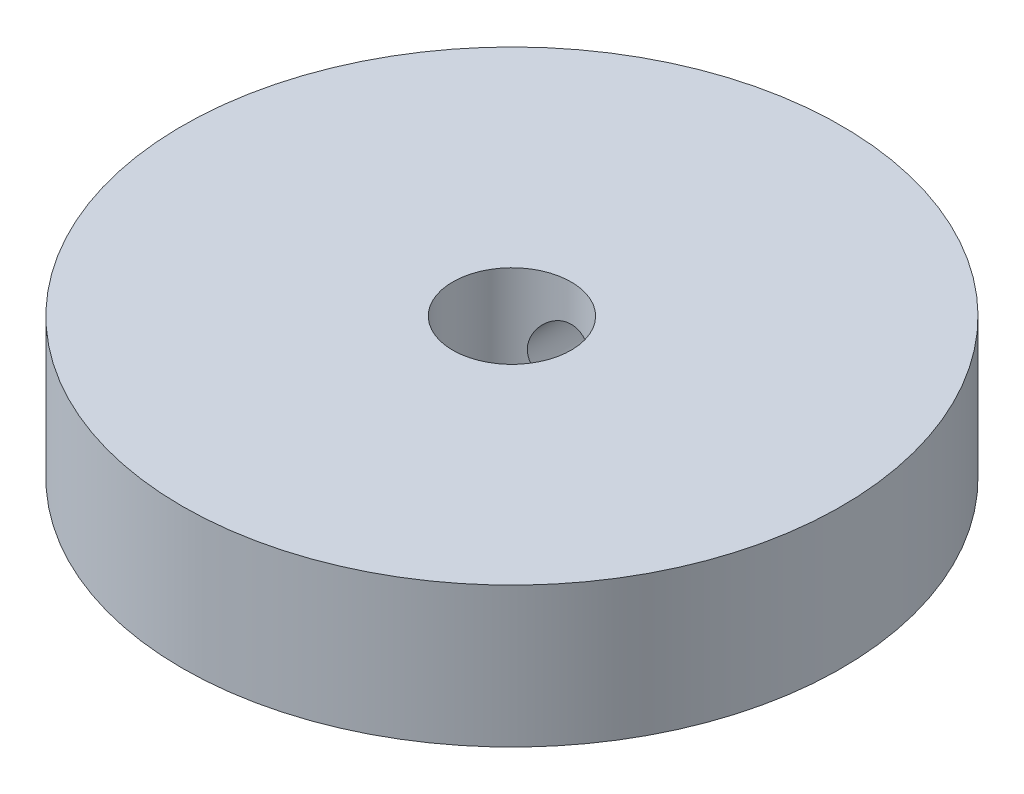
ISO-10303-21;
HEADER;
FILE_DESCRIPTION(('STEP AP214'),'2;1');
FILE_NAME('part.step','',(''),(''),'','','');
FILE_SCHEMA(('AUTOMOTIVE_DESIGN { 1 0 10303 214 1 1 1 1 }'));
ENDSEC;
DATA;
#1=APPLICATION_CONTEXT('core data for automotive mechanical design processes');
#2=APPLICATION_PROTOCOL_DEFINITION('international standard','automotive_design',2000,#1);
#3=PRODUCT_CONTEXT('',#1,'mechanical');
#4=PRODUCT('Part','Part','',(#3));
#5=PRODUCT_RELATED_PRODUCT_CATEGORY('part','',(#4));
#6=PRODUCT_DEFINITION_FORMATION('','',#4);
#7=PRODUCT_DEFINITION_CONTEXT('part definition',#1,'design');
#8=PRODUCT_DEFINITION('design','',#6,#7);
#9=PRODUCT_DEFINITION_SHAPE('','',#8);
#10=(LENGTH_UNIT() NAMED_UNIT(*) SI_UNIT(.MILLI.,.METRE.));
#11=(NAMED_UNIT(*) PLANE_ANGLE_UNIT() SI_UNIT($,.RADIAN.));
#12=(NAMED_UNIT(*) SI_UNIT($,.STERADIAN.) SOLID_ANGLE_UNIT());
#13=UNCERTAINTY_MEASURE_WITH_UNIT(LENGTH_MEASURE(1.E-05),#10,'distance_accuracy_value','');
#14=(GEOMETRIC_REPRESENTATION_CONTEXT(3) GLOBAL_UNCERTAINTY_ASSIGNED_CONTEXT((#13)) GLOBAL_UNIT_ASSIGNED_CONTEXT((#10,
#11,#12)) REPRESENTATION_CONTEXT('',''));
#15=CARTESIAN_POINT('',(0.,0.,0.));
#16=DIRECTION('',(0.,0.,1.));
#17=DIRECTION('',(1.,0.,0.));
#18=AXIS2_PLACEMENT_3D('',#15,#16,#17);
#19=CARTESIAN_POINT('',(0.,2.5,0.));
#20=DIRECTION('',(0.,1.,0.));
#21=DIRECTION('',(0.,0.,1.));
#22=AXIS2_PLACEMENT_3D('',#19,#20,#21);
#23=PLANE('',#22);
#24=CARTESIAN_POINT('',(0.,2.5,0.));
#25=DIRECTION('',(0.,1.,0.));
#26=DIRECTION('',(0.,0.,1.));
#27=AXIS2_PLACEMENT_3D('',#24,#25,#26);
#28=CIRCLE('',#27,11.7475);
#29=CARTESIAN_POINT('',(0.,2.5,11.7475));
#30=VERTEX_POINT('',#29);
#31=EDGE_CURVE('E10',#30,#30,#28,.T.);
#32=ORIENTED_EDGE('',*,*,#31,.T.);
#33=EDGE_LOOP('',(#32));
#34=FACE_BOUND('',#33,.T.);
#35=CARTESIAN_POINT('',(0.,2.5,0.));
#36=DIRECTION('',(0.,1.,0.));
#37=DIRECTION('',(0.,0.,1.));
#38=AXIS2_PLACEMENT_3D('',#35,#36,#37);
#39=CIRCLE('',#38,2.11);
#40=CARTESIAN_POINT('',(0.,2.5,2.11));
#41=VERTEX_POINT('',#40);
#42=EDGE_CURVE('E54',#41,#41,#39,.T.);
#43=ORIENTED_EDGE('',*,*,#42,.F.);
#44=EDGE_LOOP('',(#43));
#45=FACE_BOUND('',#44,.T.);
#46=ADVANCED_FACE('F35',(#34,#45),#23,.T.);
#47=CARTESIAN_POINT('',(0.,-2.5,0.));
#48=DIRECTION('',(0.,1.,0.));
#49=DIRECTION('',(0.,0.,1.));
#50=AXIS2_PLACEMENT_3D('',#47,#48,#49);
#51=PLANE('',#50);
#52=CARTESIAN_POINT('',(0.,-2.5,0.));
#53=DIRECTION('',(0.,1.,0.));
#54=DIRECTION('',(0.,0.,1.));
#55=AXIS2_PLACEMENT_3D('',#52,#53,#54);
#56=CIRCLE('',#55,11.7475);
#57=CARTESIAN_POINT('',(0.,-2.5,11.7475));
#58=VERTEX_POINT('',#57);
#59=EDGE_CURVE('E49',#58,#58,#56,.T.);
#60=ORIENTED_EDGE('',*,*,#59,.F.);
#61=EDGE_LOOP('',(#60));
#62=FACE_BOUND('',#61,.T.);
#63=CARTESIAN_POINT('',(0.,-2.5,0.));
#64=DIRECTION('',(0.,1.,0.));
#65=DIRECTION('',(0.,0.,1.));
#66=AXIS2_PLACEMENT_3D('',#63,#64,#65);
#67=CIRCLE('',#66,2.11);
#68=CARTESIAN_POINT('',(0.,-2.5,2.11));
#69=VERTEX_POINT('',#68);
#70=EDGE_CURVE('E56',#69,#69,#67,.T.);
#71=ORIENTED_EDGE('',*,*,#70,.T.);
#72=EDGE_LOOP('',(#71));
#73=FACE_BOUND('',#72,.T.);
#74=ADVANCED_FACE('F77',(#62,#73),#51,.F.);
#75=CARTESIAN_POINT('',(0.,2.5,0.));
#76=DIRECTION('',(0.,-1.,0.));
#77=DIRECTION('',(0.,0.,-1.));
#78=AXIS2_PLACEMENT_3D('',#75,#76,#77);
#79=CYLINDRICAL_SURFACE('',#78,11.7475);
#80=CARTESIAN_POINT('',(0.,1.19285384714238,-11.7475));
#81=CARTESIAN_POINT('',(-0.0668185561686535,1.19285095636255,-11.7474992203086));
#82=CARTESIAN_POINT('',(-0.133681155664915,1.18722060988803,-11.7469238588976));
#83=CARTESIAN_POINT('',(-0.265552283023875,1.1648452649471,-11.7446839551413));
#84=CARTESIAN_POINT('',(-0.330558692202216,1.14808805659783,-11.7430182163165));
#85=CARTESIAN_POINT('',(-0.456788749096235,1.1039521768317,-11.7387855688957));
#86=CARTESIAN_POINT('',(-0.518014669801575,1.07657996113002,-11.7362192081199));
#87=CARTESIAN_POINT('',(-0.634989906084586,1.01200368583644,-11.7304721957857));
#88=CARTESIAN_POINT('',(-0.690740299401381,0.974801566389668,-11.7272916654802));
#89=CARTESIAN_POINT('',(-0.795401716268653,0.891473643340563,-11.7206593531114));
#90=CARTESIAN_POINT('',(-0.844289603784024,0.845318846090332,-11.7172067119771));
#91=CARTESIAN_POINT('',(-0.933639387513844,0.745457600960837,-11.7104264059268));
#92=CARTESIAN_POINT('',(-0.974100891913565,0.691750802118761,-11.707098746828));
#93=CARTESIAN_POINT('',(-1.04553153860117,0.578164970154695,-11.7009364093578));
#94=CARTESIAN_POINT('',(-1.0764797025057,0.518272679846284,-11.6981028263669));
#95=CARTESIAN_POINT('',(-1.12787120813898,0.394107868677116,-11.6932601537628));
#96=CARTESIAN_POINT('',(-1.14831481698774,0.329835459245353,-11.6912510431845));
#97=CARTESIAN_POINT('',(-1.17804820588537,0.198971067505915,-11.6882925809359));
#98=CARTESIAN_POINT('',(-1.18737639876209,0.132387896763862,-11.6873395803482));
#99=CARTESIAN_POINT('',(-1.19473291042197,-0.00140529608653526,-11.686589919158));
#100=CARTESIAN_POINT('',(-1.19276153486872,-0.0686153011893393,-11.6867932272763));
#101=CARTESIAN_POINT('',(-1.17760652371278,-0.201489364610449,-11.6883298799757));
#102=CARTESIAN_POINT('',(-1.16446485023287,-0.267158264727675,-11.6896589953064));
#103=CARTESIAN_POINT('',(-1.12740758902559,-0.395353565160801,-11.6932908983406));
#104=CARTESIAN_POINT('',(-1.10349185169051,-0.457879921826208,-11.6955936995646));
#105=CARTESIAN_POINT('',(-1.04551909224572,-0.578147674765208,-11.700918368477));
#106=CARTESIAN_POINT('',(-1.01144347415908,-0.635880046550756,-11.7039415526517));
#107=CARTESIAN_POINT('',(-0.934131594336036,-0.744822258595788,-11.7103652416226));
#108=CARTESIAN_POINT('',(-0.890895056111041,-0.796031901916059,-11.7137657578056));
#109=CARTESIAN_POINT('',(-0.796254394175178,-0.890718828211309,-11.7205798001572));
#110=CARTESIAN_POINT('',(-0.744814034817454,-0.934159902273425,-11.7239933151953));
#111=CARTESIAN_POINT('',(-0.635351699640583,-1.01179583925762,-11.7304341463187));
#112=CARTESIAN_POINT('',(-0.577329716090177,-1.04599069131824,-11.7334614619504));
#113=CARTESIAN_POINT('',(-0.456325920047105,-1.10416214709397,-11.7387898366453));
#114=CARTESIAN_POINT('',(-0.39334320675256,-1.12813688988284,-11.7410907634245));
#115=CARTESIAN_POINT('',(-0.264217733425375,-1.16516091296387,-11.7447057657701));
#116=CARTESIAN_POINT('',(-0.198075070902877,-1.17821053015515,-11.7460198717672));
#117=CARTESIAN_POINT('',(-0.0648207902838971,-1.19296788075553,-11.7475092556584));
#118=CARTESIAN_POINT('',(0.00228524111731365,-1.19472557502301,-11.7476895500017));
#119=CARTESIAN_POINT('',(0.135836648463166,-1.1869804408805,-11.7469044525265));
#120=CARTESIAN_POINT('',(0.202282033602308,-1.17747776940771,-11.7459390766753));
#121=CARTESIAN_POINT('',(0.332481628252802,-1.14752310111618,-11.742974325904));
#122=CARTESIAN_POINT('',(0.396241279767582,-1.12709452084568,-11.7409771626343));
#123=CARTESIAN_POINT('',(0.519428724973043,-1.07589200771052,-11.7361728655002));
#124=CARTESIAN_POINT('',(0.578856418653003,-1.04511783609203,-11.7333657129431));
#125=CARTESIAN_POINT('',(0.691918750591292,-0.973973970882771,-11.727242879748));
#126=CARTESIAN_POINT('',(0.745532656719797,-0.933571480419224,-11.7239254750448));
#127=CARTESIAN_POINT('',(0.84523559167211,-0.844364846474648,-11.7171598535544));
#128=CARTESIAN_POINT('',(0.891324425595451,-0.795560485451184,-11.7137116333819));
#129=CARTESIAN_POINT('',(0.974842604042812,-0.690717375587012,-11.7070579030805));
#130=CARTESIAN_POINT('',(1.01223914072211,-0.634652423212596,-11.7038533422615));
#131=CARTESIAN_POINT('',(1.07708557624626,-0.517008737737064,-11.6980642550647));
#132=CARTESIAN_POINT('',(1.10453561475273,-0.45543008207057,-11.6954797199811));
#133=CARTESIAN_POINT('',(1.14865502440288,-0.328619126495182,-11.6912292603906));
#134=CARTESIAN_POINT('',(1.16534385944334,-0.263393656235274,-11.689561678191));
#135=CARTESIAN_POINT('',(1.18753025556042,-0.131048483415599,-11.687328799529));
#136=CARTESIAN_POINT('',(1.19302814847725,-0.0639288370828618,-11.6867634703818));
#137=CARTESIAN_POINT('',(1.19267190780427,0.0699733036089918,-11.6867998061948));
#138=CARTESIAN_POINT('',(1.18686931105434,0.136755942490788,-11.6873961731444));
#139=CARTESIAN_POINT('',(1.16418492287201,0.26839241515972,-11.6896774032475));
#140=CARTESIAN_POINT('',(1.14730311949548,0.333246246867395,-11.6913622675745));
#141=CARTESIAN_POINT('',(1.10295385773031,0.459183396099411,-11.6956291707765));
#142=CARTESIAN_POINT('',(1.07548796656594,0.520267270302184,-11.6982110768179));
#143=CARTESIAN_POINT('',(1.01075548180366,0.636966274278834,-11.7039814119443));
#144=CARTESIAN_POINT('',(0.973488933124584,0.692581429115605,-11.7071698382496));
#145=CARTESIAN_POINT('',(0.890019555123238,0.797028386666702,-11.7138113774184));
#146=CARTESIAN_POINT('',(0.843778316022724,0.845829425030526,-11.7172655879957));
#147=CARTESIAN_POINT('',(0.7437485278166,0.935001763661777,-11.7240394848366));
#148=CARTESIAN_POINT('',(0.689958175257402,0.97537104386429,-11.7273591387101));
#149=CARTESIAN_POINT('',(0.576204355009643,1.04661651501362,-11.7334988476538));
#150=CARTESIAN_POINT('',(0.516225279950296,1.07746788124999,-11.7363175882626));
#151=CARTESIAN_POINT('',(0.391947430976905,1.12861995614056,-11.7411236557071));
#152=CARTESIAN_POINT('',(0.327653610375048,1.14893253697547,-11.7431119176013));
#153=CARTESIAN_POINT('',(0.21916457025934,1.17337660982239,-11.7455345328921));
#154=CARTESIAN_POINT('',(0.175662383351248,1.18067056589598,-11.7462681376564));
#155=CARTESIAN_POINT('',(0.0881131812833163,1.19041012738955,-11.7472511272723));
#156=CARTESIAN_POINT('',(0.0440661684586554,1.19285575358271,-11.7475005141987));
#157=CARTESIAN_POINT('',(0.,1.19285384714238,-11.7475));
#158=B_SPLINE_CURVE_WITH_KNOTS('',3,(#80,#81,#82,#83,#84,#85,#86,#87,#88,#89,#90,#91,#92,#93,
#94,#95,#96,#97,#98,#99,#100,#101,#102,#103,#104,#105,#106,#107,#108,#109,#110,#111,#112,#113,
#114,#115,#116,#117,#118,#119,#120,#121,#122,#123,#124,#125,#126,#127,#128,#129,#130,#131,#132,
#133,#134,#135,#136,#137,#138,#139,#140,#141,#142,#143,#144,#145,#146,#147,#148,#149,#150,#151,
#152,#153,#154,#155,#156,#157),.UNSPECIFIED.,.T.,.F.,(4,2,2,2,2,2,2,2,2,2,2,2,2,2,2,2,2,2,2,2,2,
2,2,2,2,2,2,2,2,2,2,2,2,2,2,2,2,2,4),(0.,0.200294752798728,0.400809659851449,0.601202810775152,
0.801556439261611,1.00257009473642,1.20359309497198,1.40505625352105,1.60651428881607,
1.80727408429047,2.00802844905572,2.20803198006249,2.40803828838678,2.60841294617214,
2.80879365238931,3.01008527214558,3.21137712835619,3.41270562110838,3.61402790524647,
3.81445882642799,4.01488695421022,4.21488723316973,4.41489212801941,4.6155882891021,
4.81628964742031,5.01773665050738,5.21918082491,5.42025961554295,5.62133244358581,
5.82149040913009,6.02164859045833,6.22177714502005,6.42190478235892,6.62290860232357,
6.8239605233113,7.02553248095236,7.22687686745513,7.3589698165019,7.49106219958087),.UNSPECIFIED.);
#159=CARTESIAN_POINT('',(0.,1.19285384714238,-11.7475));
#160=VERTEX_POINT('',#159);
#161=EDGE_CURVE('E59',#160,#160,#158,.T.);
#162=ORIENTED_EDGE('',*,*,#161,.T.);
#163=EDGE_LOOP('',(#162));
#164=FACE_BOUND('',#163,.T.);
#165=ORIENTED_EDGE('',*,*,#31,.F.);
#166=EDGE_LOOP('',(#165));
#167=FACE_BOUND('',#166,.T.);
#168=ORIENTED_EDGE('',*,*,#59,.T.);
#169=EDGE_LOOP('',(#168));
#170=FACE_BOUND('',#169,.T.);
#171=ADVANCED_FACE('F37',(#164,#167,#170),#79,.T.);
#172=CARTESIAN_POINT('',(0.,2.5,0.));
#173=DIRECTION('',(0.,-1.,0.));
#174=DIRECTION('',(0.,0.,-1.));
#175=AXIS2_PLACEMENT_3D('',#172,#173,#174);
#176=CYLINDRICAL_SURFACE('',#175,2.11);
#177=CARTESIAN_POINT('',(0.,1.19285384714238,-2.11));
#178=CARTESIAN_POINT('',(-0.0617574750714294,1.19285725932088,-2.11000300089849));
#179=CARTESIAN_POINT('',(-0.123495716188226,1.18803773031089,-2.10726640639139));
#180=CARTESIAN_POINT('',(-0.245044404085788,1.16903235399487,-2.09661015933867));
#181=CARTESIAN_POINT('',(-0.304854738614639,1.15484596233488,-2.08869020556307));
#182=CARTESIAN_POINT('',(-0.420681081913013,1.11786145280671,-2.06847202103185));
#183=CARTESIAN_POINT('',(-0.476710230443512,1.09509518343563,-2.05618999189096));
#184=CARTESIAN_POINT('',(-0.584042301303055,1.04181971209439,-2.0283178204195));
#185=CARTESIAN_POINT('',(-0.635344043208525,1.01130858335138,-2.01272685504732));
#186=CARTESIAN_POINT('',(-0.735851869358382,0.940982604226794,-1.97829244766686));
#187=CARTESIAN_POINT('',(-0.78464991268058,0.900660658822537,-1.95929660343036));
#188=CARTESIAN_POINT('',(-0.875183802438372,0.812976773686049,-1.92056834969319));
#189=CARTESIAN_POINT('',(-0.916912105165658,0.765607414002383,-1.9008351804904));
#190=CARTESIAN_POINT('',(-0.996587121149639,0.659231786699288,-1.86040669270126));
#191=CARTESIAN_POINT('',(-1.03366592658259,0.59952447731357,-1.83983064922426));
#192=CARTESIAN_POINT('',(-1.09709858068934,0.473529046694949,-1.80272924566894));
#193=CARTESIAN_POINT('',(-1.12346828330075,0.40725083545741,-1.78619791226384));
#194=CARTESIAN_POINT('',(-1.15973238480776,0.284729667494015,-1.76280497548175));
#195=CARTESIAN_POINT('',(-1.17196007959165,0.229429580786415,-1.75462354520275));
#196=CARTESIAN_POINT('',(-1.1884379177757,0.117157365940326,-1.74350756789927));
#197=CARTESIAN_POINT('',(-1.192696332095,0.0601870337265616,-1.74056758119191));
#198=CARTESIAN_POINT('',(-1.19300296374553,-0.0538562160669354,-1.74035742084403));
#199=CARTESIAN_POINT('',(-1.1890408617938,-0.110929172618388,-1.74309437351184));
#200=CARTESIAN_POINT('',(-1.17311785359911,-0.223446980137061,-1.75384803351222));
#201=CARTESIAN_POINT('',(-1.16115156688132,-0.278890709736709,-1.76186829226891));
#202=CARTESIAN_POINT('',(-1.12983781403887,-0.386668347965161,-1.78210796023182));
#203=CARTESIAN_POINT('',(-1.11050679114826,-0.439008886393093,-1.79431800891282));
#204=CARTESIAN_POINT('',(-1.06513028833719,-0.539870321599766,-1.82161939372138));
#205=CARTESIAN_POINT('',(-1.03908221520495,-0.588389733714068,-1.83671184205489));
#206=CARTESIAN_POINT('',(-0.976279084252931,-0.688322402758243,-1.87094848907141));
#207=CARTESIAN_POINT('',(-0.938484892960434,-0.73899308122279,-1.89035674542471));
#208=CARTESIAN_POINT('',(-0.855418375966287,-0.833747288437907,-1.92936982457699));
#209=CARTESIAN_POINT('',(-0.810139856166712,-0.877825302997054,-1.9489747974501));
#210=CARTESIAN_POINT('',(-0.707467770782737,-0.962966645183049,-1.98870199025303));
#211=CARTESIAN_POINT('',(-0.649291724752304,-1.0031782735149,-2.00864783972639));
#212=CARTESIAN_POINT('',(-0.52577711291353,-1.07307181775496,-2.04445137443006));
#213=CARTESIAN_POINT('',(-0.460443186767855,-1.10276050227896,-2.06031168577808));
#214=CARTESIAN_POINT('',(-0.32918275580912,-1.14848753106721,-2.08515746596356));
#215=CARTESIAN_POINT('',(-0.263617139603072,-1.16533521428225,-2.09454611001259));
#216=CARTESIAN_POINT('',(-0.130015274128189,-1.18767450649407,-2.10705519799119));
#217=CARTESIAN_POINT('',(-0.061981422600412,-1.19317685131833,-2.11018156768394));
#218=CARTESIAN_POINT('',(0.0659290920085842,-1.19254071081616,-2.10982388837638));
#219=CARTESIAN_POINT('',(0.12581932689237,-1.18770141522079,-2.10707757871392));
#220=CARTESIAN_POINT('',(0.243778118170123,-1.16920310792516,-2.09670616082211));
#221=CARTESIAN_POINT('',(0.301846631892797,-1.15554388979192,-2.08908093840036));
#222=CARTESIAN_POINT('',(0.414218472641017,-1.12016525614226,-2.06972308218328));
#223=CARTESIAN_POINT('',(0.468547131630084,-1.09850808963624,-2.05802220861492));
#224=CARTESIAN_POINT('',(0.572845633285018,-1.04790806604572,-2.03146444760127));
#225=CARTESIAN_POINT('',(0.62281437773841,-1.01896338041181,-2.01660676821167));
#226=CARTESIAN_POINT('',(0.722556525495586,-0.951217805936896,-1.98319371962117));
#227=CARTESIAN_POINT('',(0.77177124349089,-0.911705697369848,-1.96441461202035));
#228=CARTESIAN_POINT('',(0.863253415567168,-0.825618560865327,-1.92597025072331));
#229=CARTESIAN_POINT('',(0.905512910089124,-0.779035556534037,-1.90630401412681));
#230=CARTESIAN_POINT('',(0.986496806494215,-0.674218099427441,-1.86579354832205));
#231=CARTESIAN_POINT('',(1.02435419059898,-0.615269618474589,-1.84504962283578));
#232=CARTESIAN_POINT('',(1.08950638531375,-0.490711714377117,-1.80734595331332));
#233=CARTESIAN_POINT('',(1.11681563592996,-0.425111553676109,-1.79038104950826));
#234=CARTESIAN_POINT('',(1.15502762609978,-0.303282179989335,-1.76590296686027));
#235=CARTESIAN_POINT('',(1.16817955881163,-0.248008564486306,-1.75714924212387));
#236=CARTESIAN_POINT('',(1.18648382362105,-0.135607876945395,-1.74484452502296));
#237=CARTESIAN_POINT('',(1.19164483080319,-0.0784828837008957,-1.74128789084497));
#238=CARTESIAN_POINT('',(1.193686080958,0.0360841321967521,-1.7398895598839));
#239=CARTESIAN_POINT('',(1.19055222716142,0.0935265287760523,-1.74205759191652));
#240=CARTESIAN_POINT('',(1.17616081184122,0.20692413049473,-1.75180408053421));
#241=CARTESIAN_POINT('',(1.16489806719965,0.262878363142253,-1.75938598906534));
#242=CARTESIAN_POINT('',(1.13499223072578,0.371240048763037,-1.77882044535826));
#243=CARTESIAN_POINT('',(1.11643606243429,0.423681055106933,-1.79062255218758));
#244=CARTESIAN_POINT('',(1.07260413387022,0.524846342653948,-1.81721655458141));
#245=CARTESIAN_POINT('',(1.04732584033513,0.573569213734168,-1.83200957678075));
#246=CARTESIAN_POINT('',(0.986297417193168,0.673847015679014,-1.86566539012004));
#247=CARTESIAN_POINT('',(0.94953683725679,0.724694702485637,-1.88480456622086));
#248=CARTESIAN_POINT('',(0.868591301157564,0.819977198359943,-1.9234509503068));
#249=CARTESIAN_POINT('',(0.824400272502843,0.864406706543252,-1.94295844763038));
#250=CARTESIAN_POINT('',(0.723701597614187,0.950816204828939,-1.98283001119177));
#251=CARTESIAN_POINT('',(0.66635902061374,0.991908977825259,-2.00302944130841));
#252=CARTESIAN_POINT('',(0.544386925146211,1.06374066733375,-2.0395556551276));
#253=CARTESIAN_POINT('',(0.479760545978113,1.0944840218117,-2.05588409786937));
#254=CARTESIAN_POINT('',(0.347204847236207,1.14331301148243,-2.08229592615407));
#255=CARTESIAN_POINT('',(0.279459466256875,1.16178923691723,-2.09257071092142));
#256=CARTESIAN_POINT('',(0.141132348509794,1.18655140148711,-2.10641756745869));
#257=CARTESIAN_POINT('',(0.0705536226816588,1.19284994896561,-2.10999657168206));
#258=CARTESIAN_POINT('',(0.,1.19285384714238,-2.11));
#259=B_SPLINE_CURVE_WITH_KNOTS('',3,(#177,#178,#179,#180,#181,#182,#183,#184,#185,#186,#187,
#188,#189,#190,#191,#192,#193,#194,#195,#196,#197,#198,#199,#200,#201,#202,#203,#204,#205,#206,
#207,#208,#209,#210,#211,#212,#213,#214,#215,#216,#217,#218,#219,#220,#221,#222,#223,#224,#225,
#226,#227,#228,#229,#230,#231,#232,#233,#234,#235,#236,#237,#238,#239,#240,#241,#242,#243,#244,
#245,#246,#247,#248,#249,#250,#251,#252,#253,#254,#255,#256,#257,#258),.UNSPECIFIED.,.T.,.F.,(4,
2,2,2,2,2,2,2,2,2,2,2,2,2,2,2,2,2,2,2,2,2,2,2,2,2,2,2,2,2,2,2,2,2,2,2,2,2,2,2,4),(0.,
0.184999495298661,0.37000974276411,0.554339890623992,0.738715941319595,0.936195210247483,
1.13388388850322,1.35249937676896,1.57079003271239,1.74171691325127,1.91246629870428,
2.08343015696978,2.25450905410899,2.42520820117441,2.59597334796743,2.79356186227528,
2.9913147289825,3.21061337544503,3.42977070654946,3.63360341748111,3.83724315761685,
4.01681035284657,4.19638175105333,4.37458400747919,4.55283102220121,4.74958047604946,
4.94655354753261,5.1646798979858,5.38250657411199,5.55422606718985,5.72575900763061,
5.89758364822103,6.06951794399752,6.23946239208667,6.40947097547408,6.60549080899745,
6.8016716242384,7.02068971999765,7.23961377794753,7.45118201046201,7.66253107504897),.UNSPECIFIED.);
#260=CARTESIAN_POINT('',(0.,1.19285384714238,-2.11));
#261=VERTEX_POINT('',#260);
#262=EDGE_CURVE('E40',#261,#261,#259,.T.);
#263=ORIENTED_EDGE('',*,*,#262,.F.);
#264=EDGE_LOOP('',(#263));
#265=FACE_BOUND('',#264,.T.);
#266=ORIENTED_EDGE('',*,*,#42,.T.);
#267=EDGE_LOOP('',(#266));
#268=FACE_BOUND('',#267,.T.);
#269=ORIENTED_EDGE('',*,*,#70,.F.);
#270=EDGE_LOOP('',(#269));
#271=FACE_BOUND('',#270,.T.);
#272=ADVANCED_FACE('F69',(#265,#268,#271),#176,.F.);
#273=CARTESIAN_POINT('',(0.,0.,-11.7475));
#274=DIRECTION('',(0.,0.,1.));
#275=DIRECTION('',(1.,0.,0.));
#276=AXIS2_PLACEMENT_3D('',#273,#274,#275);
#277=CYLINDRICAL_SURFACE('',#276,1.19285384714238);
#278=ORIENTED_EDGE('',*,*,#262,.T.);
#279=EDGE_LOOP('',(#278));
#280=FACE_BOUND('',#279,.T.);
#281=ORIENTED_EDGE('',*,*,#161,.F.);
#282=EDGE_LOOP('',(#281));
#283=FACE_BOUND('',#282,.T.);
#284=ADVANCED_FACE('F66',(#280,#283),#277,.F.);
#285=CLOSED_SHELL('',(#46,#74,#171,#272,#284));
#286=MANIFOLD_SOLID_BREP('B2',#285);
#287=ADVANCED_BREP_SHAPE_REPRESENTATION('',(#18,#286),#14);
#288=SHAPE_DEFINITION_REPRESENTATION(#9,#287);
ENDSEC;
END-ISO-10303-21;
